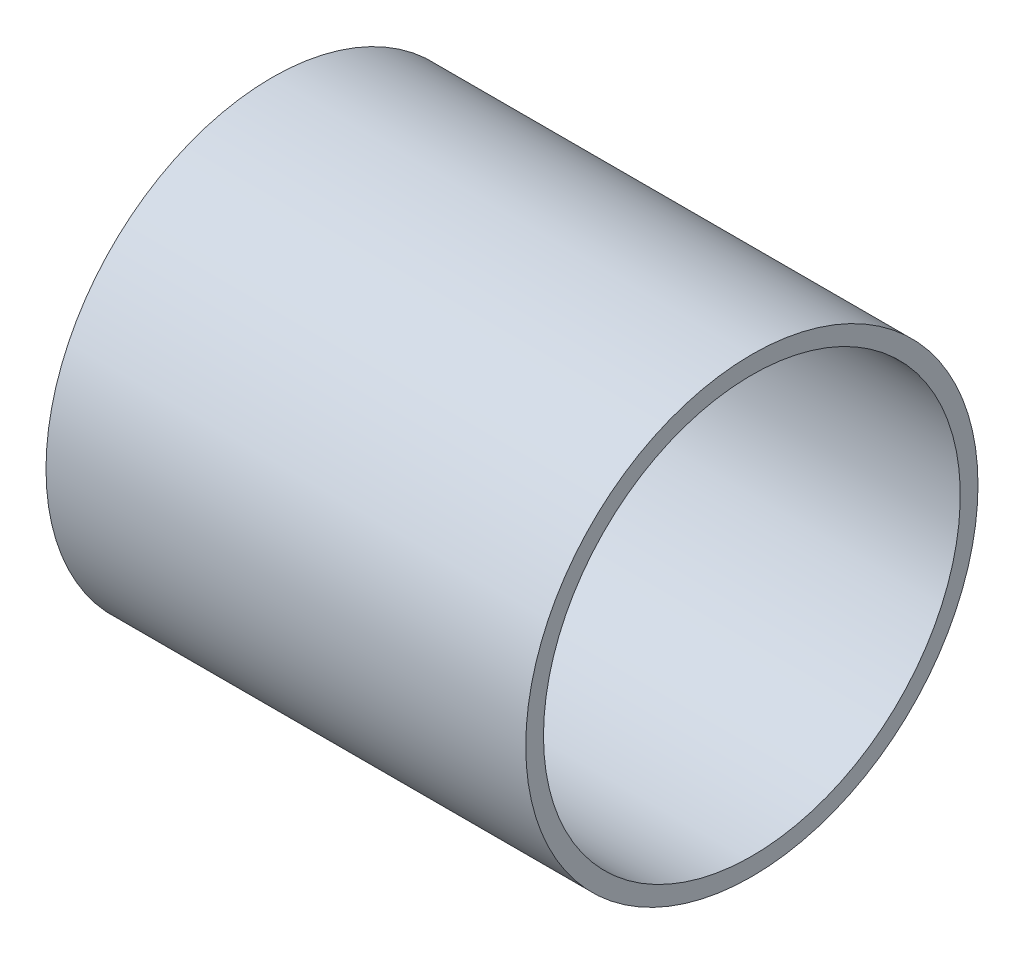
ISO-10303-21;
HEADER;
FILE_DESCRIPTION(('STEP AP214'),'2;1');
FILE_NAME('part.step','',(''),(''),'','','');
FILE_SCHEMA(('AUTOMOTIVE_DESIGN { 1 0 10303 214 1 1 1 1 }'));
ENDSEC;
DATA;
#1=APPLICATION_CONTEXT('core data for automotive mechanical design processes');
#2=APPLICATION_PROTOCOL_DEFINITION('international standard','automotive_design',2000,#1);
#3=PRODUCT_CONTEXT('',#1,'mechanical');
#4=PRODUCT('Part','Part','',(#3));
#5=PRODUCT_RELATED_PRODUCT_CATEGORY('part','',(#4));
#6=PRODUCT_DEFINITION_FORMATION('','',#4);
#7=PRODUCT_DEFINITION_CONTEXT('part definition',#1,'design');
#8=PRODUCT_DEFINITION('design','',#6,#7);
#9=PRODUCT_DEFINITION_SHAPE('','',#8);
#10=(LENGTH_UNIT() NAMED_UNIT(*) SI_UNIT(.MILLI.,.METRE.));
#11=(NAMED_UNIT(*) PLANE_ANGLE_UNIT() SI_UNIT($,.RADIAN.));
#12=(NAMED_UNIT(*) SI_UNIT($,.STERADIAN.) SOLID_ANGLE_UNIT());
#13=UNCERTAINTY_MEASURE_WITH_UNIT(LENGTH_MEASURE(1.E-05),#10,'distance_accuracy_value','');
#14=(GEOMETRIC_REPRESENTATION_CONTEXT(3) GLOBAL_UNCERTAINTY_ASSIGNED_CONTEXT((#13)) GLOBAL_UNIT_ASSIGNED_CONTEXT((#10,
#11,#12)) REPRESENTATION_CONTEXT('',''));
#15=CARTESIAN_POINT('',(0.,0.,0.));
#16=DIRECTION('',(0.,0.,1.));
#17=DIRECTION('',(1.,0.,0.));
#18=AXIS2_PLACEMENT_3D('',#15,#16,#17);
#19=CARTESIAN_POINT('',(-72.8939918967907,0.,0.));
#20=DIRECTION('',(-1.,0.,0.));
#21=DIRECTION('',(0.,0.,1.));
#22=AXIS2_PLACEMENT_3D('',#19,#20,#21);
#23=CYLINDRICAL_SURFACE('',#22,15.875);
#24=CARTESIAN_POINT('',(-16.8402,0.,0.));
#25=DIRECTION('',(-1.,0.,0.));
#26=DIRECTION('',(0.,0.,1.));
#27=AXIS2_PLACEMENT_3D('',#24,#25,#26);
#28=CIRCLE('',#27,15.875);
#29=CARTESIAN_POINT('',(-16.8402,0.,15.875));
#30=VERTEX_POINT('',#29);
#31=EDGE_CURVE('E46',#30,#30,#28,.T.);
#32=ORIENTED_EDGE('',*,*,#31,.F.);
#33=EDGE_LOOP('',(#32));
#34=FACE_BOUND('',#33,.T.);
#35=CARTESIAN_POINT('',(16.8402,0.,0.));
#36=DIRECTION('',(-1.,0.,0.));
#37=DIRECTION('',(0.,0.,1.));
#38=AXIS2_PLACEMENT_3D('',#35,#36,#37);
#39=CIRCLE('',#38,15.875);
#40=CARTESIAN_POINT('',(16.8402,0.,15.875));
#41=VERTEX_POINT('',#40);
#42=EDGE_CURVE('E10',#41,#41,#39,.T.);
#43=ORIENTED_EDGE('',*,*,#42,.T.);
#44=EDGE_LOOP('',(#43));
#45=FACE_BOUND('',#44,.T.);
#46=ADVANCED_FACE('F32',(#34,#45),#23,.T.);
#47=CARTESIAN_POINT('',(16.8402,0.,-15.875));
#48=DIRECTION('',(-1.,0.,0.));
#49=DIRECTION('',(0.,0.,1.));
#50=AXIS2_PLACEMENT_3D('',#47,#48,#49);
#51=PLANE('',#50);
#52=ORIENTED_EDGE('',*,*,#42,.F.);
#53=EDGE_LOOP('',(#52));
#54=FACE_BOUND('',#53,.T.);
#55=CARTESIAN_POINT('',(16.8402,0.,0.));
#56=DIRECTION('',(-1.,0.,0.));
#57=DIRECTION('',(0.,0.,1.));
#58=AXIS2_PLACEMENT_3D('',#55,#56,#57);
#59=CIRCLE('',#58,14.6304);
#60=CARTESIAN_POINT('',(16.8402,0.,14.6304));
#61=VERTEX_POINT('',#60);
#62=EDGE_CURVE('E38',#61,#61,#59,.T.);
#63=ORIENTED_EDGE('',*,*,#62,.T.);
#64=EDGE_LOOP('',(#63));
#65=FACE_BOUND('',#64,.T.);
#66=ADVANCED_FACE('F55',(#54,#65),#51,.F.);
#67=CARTESIAN_POINT('',(-72.8939918967907,0.,0.));
#68=DIRECTION('',(-1.,0.,0.));
#69=DIRECTION('',(0.,0.,1.));
#70=AXIS2_PLACEMENT_3D('',#67,#68,#69);
#71=CYLINDRICAL_SURFACE('',#70,14.6304);
#72=ORIENTED_EDGE('',*,*,#62,.F.);
#73=EDGE_LOOP('',(#72));
#74=FACE_BOUND('',#73,.T.);
#75=CARTESIAN_POINT('',(-16.8402,0.,0.));
#76=DIRECTION('',(-1.,0.,0.));
#77=DIRECTION('',(0.,0.,1.));
#78=AXIS2_PLACEMENT_3D('',#75,#76,#77);
#79=CIRCLE('',#78,14.6304);
#80=CARTESIAN_POINT('',(-16.8402,0.,14.6304));
#81=VERTEX_POINT('',#80);
#82=EDGE_CURVE('E42',#81,#81,#79,.T.);
#83=ORIENTED_EDGE('',*,*,#82,.T.);
#84=EDGE_LOOP('',(#83));
#85=FACE_BOUND('',#84,.T.);
#86=ADVANCED_FACE('F59',(#74,#85),#71,.F.);
#87=CARTESIAN_POINT('',(-16.8402,0.,-15.875));
#88=DIRECTION('',(1.,0.,0.));
#89=DIRECTION('',(0.,0.,-1.));
#90=AXIS2_PLACEMENT_3D('',#87,#88,#89);
#91=PLANE('',#90);
#92=ORIENTED_EDGE('',*,*,#82,.F.);
#93=EDGE_LOOP('',(#92));
#94=FACE_BOUND('',#93,.T.);
#95=ORIENTED_EDGE('',*,*,#31,.T.);
#96=EDGE_LOOP('',(#95));
#97=FACE_BOUND('',#96,.T.);
#98=ADVANCED_FACE('F52',(#94,#97),#91,.F.);
#99=CLOSED_SHELL('',(#46,#66,#86,#98));
#100=MANIFOLD_SOLID_BREP('B2',#99);
#101=ADVANCED_BREP_SHAPE_REPRESENTATION('',(#18,#100),#14);
#102=SHAPE_DEFINITION_REPRESENTATION(#9,#101);
ENDSEC;
END-ISO-10303-21;
